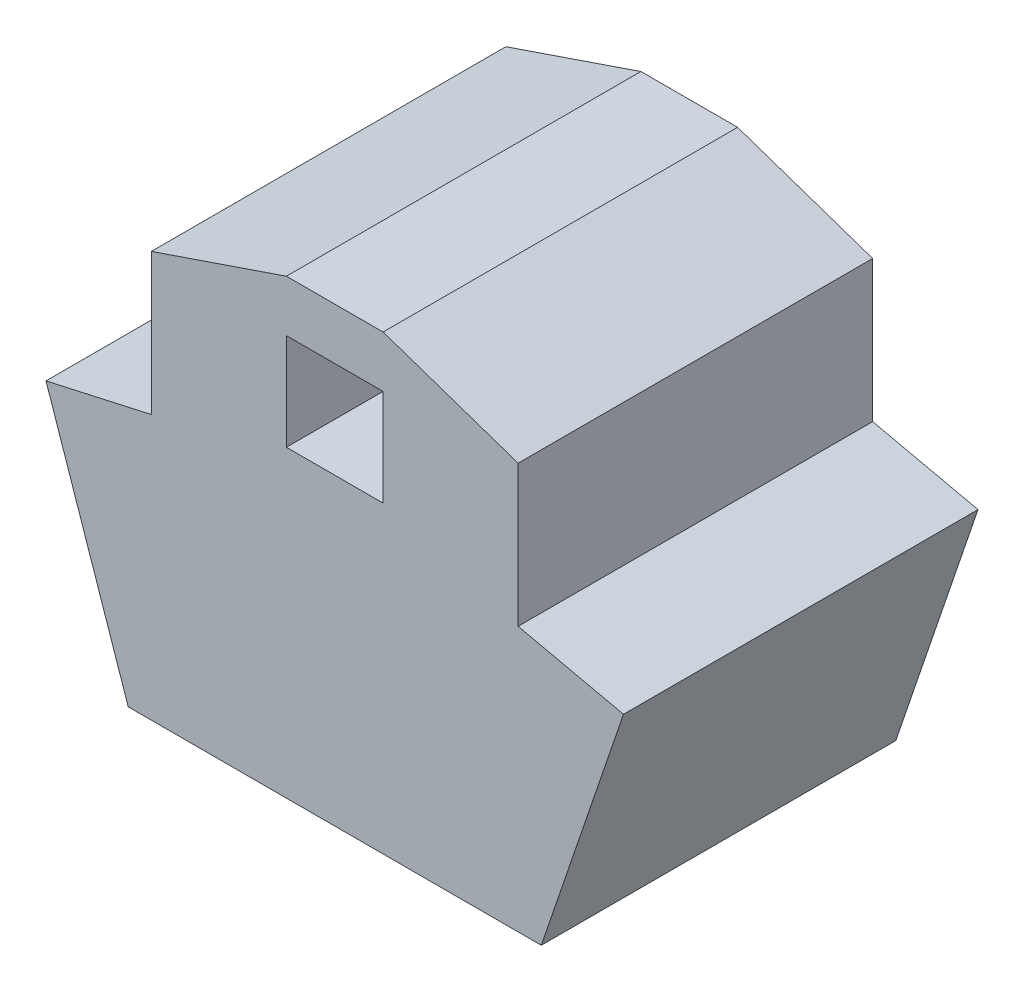
ISO-10303-21;
HEADER;
FILE_DESCRIPTION(('STEP AP214'),'2;1');
FILE_NAME('part.step','',(''),(''),'','','');
FILE_SCHEMA(('AUTOMOTIVE_DESIGN { 1 0 10303 214 1 1 1 1 }'));
ENDSEC;
DATA;
#1=APPLICATION_CONTEXT('core data for automotive mechanical design processes');
#2=APPLICATION_PROTOCOL_DEFINITION('international standard','automotive_design',2000,#1);
#3=PRODUCT_CONTEXT('',#1,'mechanical');
#4=PRODUCT('Part','Part','',(#3));
#5=PRODUCT_RELATED_PRODUCT_CATEGORY('part','',(#4));
#6=PRODUCT_DEFINITION_FORMATION('','',#4);
#7=PRODUCT_DEFINITION_CONTEXT('part definition',#1,'design');
#8=PRODUCT_DEFINITION('design','',#6,#7);
#9=PRODUCT_DEFINITION_SHAPE('','',#8);
#10=(LENGTH_UNIT() NAMED_UNIT(*) SI_UNIT(.MILLI.,.METRE.));
#11=(NAMED_UNIT(*) PLANE_ANGLE_UNIT() SI_UNIT($,.RADIAN.));
#12=(NAMED_UNIT(*) SI_UNIT($,.STERADIAN.) SOLID_ANGLE_UNIT());
#13=UNCERTAINTY_MEASURE_WITH_UNIT(LENGTH_MEASURE(1.E-05),#10,'distance_accuracy_value','');
#14=(GEOMETRIC_REPRESENTATION_CONTEXT(3) GLOBAL_UNCERTAINTY_ASSIGNED_CONTEXT((#13)) GLOBAL_UNIT_ASSIGNED_CONTEXT((#10,
#11,#12)) REPRESENTATION_CONTEXT('',''));
#15=CARTESIAN_POINT('',(0.,0.,0.));
#16=DIRECTION('',(0.,0.,1.));
#17=DIRECTION('',(1.,0.,0.));
#18=AXIS2_PLACEMENT_3D('',#15,#16,#17);
#19=CARTESIAN_POINT('',(-42.816348708637,-73.0225,225.540123598026));
#20=DIRECTION('',(0.,1.,0.));
#21=DIRECTION('',(0.,0.,1.));
#22=AXIS2_PLACEMENT_3D('',#19,#20,#21);
#23=PLANE('',#22);
#24=DIRECTION('',(1.,0.,0.));
#25=VECTOR('',#24,1.);
#26=CARTESIAN_POINT('',(-42.816348708637,-73.0225,73.5));
#27=LINE('',#26,#25);
#28=CARTESIAN_POINT('',(-42.816348708637,-73.0225,73.5000000000001));
#29=VERTEX_POINT('',#28);
#30=CARTESIAN_POINT('',(42.816348708637,-73.0225,73.5000000000001));
#31=VERTEX_POINT('',#30);
#32=EDGE_CURVE('E159',#29,#31,#27,.T.);
#33=ORIENTED_EDGE('',*,*,#32,.F.);
#34=DIRECTION('',(0.,0.,-1.));
#35=VECTOR('',#34,1.);
#36=CARTESIAN_POINT('',(-42.816348708637,-73.0225,225.540123598026));
#37=LINE('',#36,#35);
#38=CARTESIAN_POINT('',(-42.816348708637,-73.0225,0.));
#39=VERTEX_POINT('',#38);
#40=EDGE_CURVE('E144',#29,#39,#37,.T.);
#41=ORIENTED_EDGE('',*,*,#40,.T.);
#42=DIRECTION('',(1.,0.,0.));
#43=VECTOR('',#42,1.);
#44=CARTESIAN_POINT('',(-42.816348708637,-73.0225,0.));
#45=LINE('',#44,#43);
#46=CARTESIAN_POINT('',(42.816348708637,-73.0225,0.));
#47=VERTEX_POINT('',#46);
#48=EDGE_CURVE('E157',#39,#47,#45,.T.);
#49=ORIENTED_EDGE('',*,*,#48,.T.);
#50=DIRECTION('',(0.,0.,-1.));
#51=VECTOR('',#50,1.);
#52=CARTESIAN_POINT('',(42.816348708637,-73.0225,225.540123598026));
#53=LINE('',#52,#51);
#54=EDGE_CURVE('E160',#31,#47,#53,.T.);
#55=ORIENTED_EDGE('',*,*,#54,.F.);
#56=EDGE_LOOP('',(#33,#41,#49,#55));
#57=FACE_BOUND('',#56,.T.);
#58=ADVANCED_FACE('F36',(#57),#23,.F.);
#59=CARTESIAN_POINT('',(0.,0.,73.5));
#60=DIRECTION('',(0.,0.,1.));
#61=DIRECTION('',(1.,0.,0.));
#62=AXIS2_PLACEMENT_3D('',#59,#60,#61);
#63=PLANE('',#62);
#64=DIRECTION('',(-0.975973558178813,0.217888994067592,0.));
#65=VECTOR('',#64,1.);
#66=CARTESIAN_POINT('',(59.8618032540933,-23.0225,73.5));
#67=LINE('',#66,#65);
#68=CARTESIAN_POINT('',(59.8618032540933,-23.0225,73.5));
#69=VERTEX_POINT('',#68);
#70=CARTESIAN_POINT('',(38.0225,-18.1468107179553,73.5));
#71=VERTEX_POINT('',#70);
#72=EDGE_CURVE('E195',#69,#71,#67,.T.);
#73=ORIENTED_EDGE('',*,*,#72,.T.);
#74=DIRECTION('',(0.,1.,0.));
#75=VECTOR('',#74,1.);
#76=CARTESIAN_POINT('',(38.0225,11.1468107179553,73.5));
#77=LINE('',#76,#75);
#78=CARTESIAN_POINT('',(38.0225,11.1468107179553,73.5));
#79=VERTEX_POINT('',#78);
#80=EDGE_CURVE('E198',#71,#79,#77,.T.);
#81=ORIENTED_EDGE('',*,*,#80,.T.);
#82=DIRECTION('',(-0.94651018817854,0.322673927788138,0.));
#83=VECTOR('',#82,1.);
#84=CARTESIAN_POINT('',(10.0225,20.6922652634099,73.5));
#85=LINE('',#84,#83);
#86=CARTESIAN_POINT('',(10.0225,20.6922652634099,73.5));
#87=VERTEX_POINT('',#86);
#88=EDGE_CURVE('E200',#79,#87,#85,.T.);
#89=ORIENTED_EDGE('',*,*,#88,.T.);
#90=DIRECTION('',(-1.,0.,0.));
#91=VECTOR('',#90,1.);
#92=CARTESIAN_POINT('',(10.0225,20.6922652634099,73.5));
#93=LINE('',#92,#91);
#94=CARTESIAN_POINT('',(-10.0225,20.6922652634099,73.5));
#95=VERTEX_POINT('',#94);
#96=EDGE_CURVE('E202',#87,#95,#93,.T.);
#97=ORIENTED_EDGE('',*,*,#96,.T.);
#98=DIRECTION('',(-0.94651018817854,-0.322673927788139,0.));
#99=VECTOR('',#98,1.);
#100=CARTESIAN_POINT('',(-10.0225,20.6922652634099,73.5));
#101=LINE('',#100,#99);
#102=CARTESIAN_POINT('',(-38.0225,11.1468107179553,73.5));
#103=VERTEX_POINT('',#102);
#104=EDGE_CURVE('E204',#95,#103,#101,.T.);
#105=ORIENTED_EDGE('',*,*,#104,.T.);
#106=DIRECTION('',(0.,-1.,0.));
#107=VECTOR('',#106,1.);
#108=CARTESIAN_POINT('',(-38.0225,11.1468107179553,73.5));
#109=LINE('',#108,#107);
#110=CARTESIAN_POINT('',(-38.0225,-18.1468107179553,73.5));
#111=VERTEX_POINT('',#110);
#112=EDGE_CURVE('E206',#103,#111,#109,.T.);
#113=ORIENTED_EDGE('',*,*,#112,.T.);
#114=DIRECTION('',(-0.975973558178813,-0.217888994067592,0.));
#115=VECTOR('',#114,1.);
#116=CARTESIAN_POINT('',(-59.8618032540933,-23.0225,73.5));
#117=LINE('',#116,#115);
#118=CARTESIAN_POINT('',(-59.8618032540933,-23.0225,73.5));
#119=VERTEX_POINT('',#118);
#120=EDGE_CURVE('E208',#111,#119,#117,.T.);
#121=ORIENTED_EDGE('',*,*,#120,.T.);
#122=DIRECTION('',(0.322673927788167,-0.94651018817853,0.));
#123=VECTOR('',#122,1.);
#124=CARTESIAN_POINT('',(-59.8618032540933,-23.0225,73.5));
#125=LINE('',#124,#123);
#126=EDGE_CURVE('E210',#119,#29,#125,.T.);
#127=ORIENTED_EDGE('',*,*,#126,.T.);
#128=ORIENTED_EDGE('',*,*,#32,.T.);
#129=DIRECTION('',(0.322673927788167,0.94651018817853,0.));
#130=VECTOR('',#129,1.);
#131=CARTESIAN_POINT('',(59.8618032540933,-23.0225,73.5));
#132=LINE('',#131,#130);
#133=EDGE_CURVE('E212',#31,#69,#132,.T.);
#134=ORIENTED_EDGE('',*,*,#133,.T.);
#135=EDGE_LOOP('',(#73,#81,#89,#97,#105,#113,#121,#127,#128,#134));
#136=FACE_BOUND('',#135,.T.);
#137=DIRECTION('',(1.,0.,0.));
#138=VECTOR('',#137,1.);
#139=CARTESIAN_POINT('',(10.0225,-10.0225,73.5));
#140=LINE('',#139,#138);
#141=CARTESIAN_POINT('',(-10.0225,-10.0225,73.5));
#142=VERTEX_POINT('',#141);
#143=CARTESIAN_POINT('',(10.0225,-10.0225,73.5));
#144=VERTEX_POINT('',#143);
#145=EDGE_CURVE('E171',#142,#144,#140,.T.);
#146=ORIENTED_EDGE('',*,*,#145,.F.);
#147=DIRECTION('',(0.,-1.,0.));
#148=VECTOR('',#147,1.);
#149=CARTESIAN_POINT('',(-10.0225,-10.0225,73.5));
#150=LINE('',#149,#148);
#151=CARTESIAN_POINT('',(-10.0225,10.0225,73.5));
#152=VERTEX_POINT('',#151);
#153=EDGE_CURVE('E169',#152,#142,#150,.T.);
#154=ORIENTED_EDGE('',*,*,#153,.F.);
#155=DIRECTION('',(-1.,0.,0.));
#156=VECTOR('',#155,1.);
#157=CARTESIAN_POINT('',(10.0225,10.0225,73.5));
#158=LINE('',#157,#156);
#159=CARTESIAN_POINT('',(10.0225,10.0225,73.5));
#160=VERTEX_POINT('',#159);
#161=EDGE_CURVE('E176',#160,#152,#158,.T.);
#162=ORIENTED_EDGE('',*,*,#161,.F.);
#163=DIRECTION('',(0.,1.,0.));
#164=VECTOR('',#163,1.);
#165=CARTESIAN_POINT('',(10.0225,-10.0225,73.5));
#166=LINE('',#165,#164);
#167=EDGE_CURVE('E174',#144,#160,#166,.T.);
#168=ORIENTED_EDGE('',*,*,#167,.F.);
#169=EDGE_LOOP('',(#146,#154,#162,#168));
#170=FACE_BOUND('',#169,.T.);
#171=ADVANCED_FACE('F264',(#136,#170),#63,.T.);
#172=CARTESIAN_POINT('',(0.,0.,0.));
#173=DIRECTION('',(0.,0.,1.));
#174=DIRECTION('',(1.,0.,0.));
#175=AXIS2_PLACEMENT_3D('',#172,#173,#174);
#176=PLANE('',#175);
#177=DIRECTION('',(0.,-1.,0.));
#178=VECTOR('',#177,1.);
#179=CARTESIAN_POINT('',(-10.0225,-10.0225,0.));
#180=LINE('',#179,#178);
#181=CARTESIAN_POINT('',(-10.0225,10.0225,0.));
#182=VERTEX_POINT('',#181);
#183=CARTESIAN_POINT('',(-10.0225,-10.0225,0.));
#184=VERTEX_POINT('',#183);
#185=EDGE_CURVE('E59',#182,#184,#180,.T.);
#186=ORIENTED_EDGE('',*,*,#185,.T.);
#187=DIRECTION('',(1.,0.,0.));
#188=VECTOR('',#187,1.);
#189=CARTESIAN_POINT('',(10.0225,-10.0225,0.));
#190=LINE('',#189,#188);
#191=CARTESIAN_POINT('',(10.0225,-10.0225,0.));
#192=VERTEX_POINT('',#191);
#193=EDGE_CURVE('E180',#184,#192,#190,.T.);
#194=ORIENTED_EDGE('',*,*,#193,.T.);
#195=DIRECTION('',(0.,1.,0.));
#196=VECTOR('',#195,1.);
#197=CARTESIAN_POINT('',(10.0225,-10.0225,0.));
#198=LINE('',#197,#196);
#199=CARTESIAN_POINT('',(10.0225,10.0225,0.));
#200=VERTEX_POINT('',#199);
#201=EDGE_CURVE('E183',#192,#200,#198,.T.);
#202=ORIENTED_EDGE('',*,*,#201,.T.);
#203=DIRECTION('',(-1.,0.,0.));
#204=VECTOR('',#203,1.);
#205=CARTESIAN_POINT('',(10.0225,10.0225,0.));
#206=LINE('',#205,#204);
#207=EDGE_CURVE('E172',#200,#182,#206,.T.);
#208=ORIENTED_EDGE('',*,*,#207,.T.);
#209=EDGE_LOOP('',(#186,#194,#202,#208));
#210=FACE_BOUND('',#209,.T.);
#211=DIRECTION('',(-0.975973558178813,0.217888994067592,0.));
#212=VECTOR('',#211,1.);
#213=CARTESIAN_POINT('',(59.8618032540933,-23.0225,0.));
#214=LINE('',#213,#212);
#215=CARTESIAN_POINT('',(59.8618032540933,-23.0225,0.));
#216=VERTEX_POINT('',#215);
#217=CARTESIAN_POINT('',(38.0225,-18.1468107179553,0.));
#218=VERTEX_POINT('',#217);
#219=EDGE_CURVE('E194',#216,#218,#214,.T.);
#220=ORIENTED_EDGE('',*,*,#219,.F.);
#221=DIRECTION('',(0.322673927788167,0.94651018817853,0.));
#222=VECTOR('',#221,1.);
#223=CARTESIAN_POINT('',(59.8618032540933,-23.0225,0.));
#224=LINE('',#223,#222);
#225=EDGE_CURVE('E150',#47,#216,#224,.T.);
#226=ORIENTED_EDGE('',*,*,#225,.F.);
#227=ORIENTED_EDGE('',*,*,#48,.F.);
#228=DIRECTION('',(0.322673927788167,-0.94651018817853,0.));
#229=VECTOR('',#228,1.);
#230=CARTESIAN_POINT('',(-59.8618032540933,-23.0225,0.));
#231=LINE('',#230,#229);
#232=CARTESIAN_POINT('',(-59.8618032540933,-23.0225,0.));
#233=VERTEX_POINT('',#232);
#234=EDGE_CURVE('E140',#233,#39,#231,.T.);
#235=ORIENTED_EDGE('',*,*,#234,.F.);
#236=DIRECTION('',(-0.975973558178813,-0.217888994067592,0.));
#237=VECTOR('',#236,1.);
#238=CARTESIAN_POINT('',(-59.8618032540933,-23.0225,0.));
#239=LINE('',#238,#237);
#240=CARTESIAN_POINT('',(-38.0225,-18.1468107179553,0.));
#241=VERTEX_POINT('',#240);
#242=EDGE_CURVE('E151',#241,#233,#239,.T.);
#243=ORIENTED_EDGE('',*,*,#242,.F.);
#244=DIRECTION('',(0.,-1.,0.));
#245=VECTOR('',#244,1.);
#246=CARTESIAN_POINT('',(-38.0225,11.1468107179553,0.));
#247=LINE('',#246,#245);
#248=CARTESIAN_POINT('',(-38.0225,11.1468107179553,0.));
#249=VERTEX_POINT('',#248);
#250=EDGE_CURVE('E226',#249,#241,#247,.T.);
#251=ORIENTED_EDGE('',*,*,#250,.F.);
#252=DIRECTION('',(-0.94651018817854,-0.322673927788139,0.));
#253=VECTOR('',#252,1.);
#254=CARTESIAN_POINT('',(-10.0225,20.6922652634099,0.));
#255=LINE('',#254,#253);
#256=CARTESIAN_POINT('',(-10.0225,20.6922652634099,0.));
#257=VERTEX_POINT('',#256);
#258=EDGE_CURVE('E224',#257,#249,#255,.T.);
#259=ORIENTED_EDGE('',*,*,#258,.F.);
#260=DIRECTION('',(-1.,0.,0.));
#261=VECTOR('',#260,1.);
#262=CARTESIAN_POINT('',(-10.0225,20.6922652634099,0.));
#263=LINE('',#262,#261);
#264=CARTESIAN_POINT('',(10.0225,20.6922652634099,0.));
#265=VERTEX_POINT('',#264);
#266=EDGE_CURVE('E222',#265,#257,#263,.T.);
#267=ORIENTED_EDGE('',*,*,#266,.F.);
#268=DIRECTION('',(-0.94651018817854,0.322673927788138,0.));
#269=VECTOR('',#268,1.);
#270=CARTESIAN_POINT('',(10.0225,20.6922652634099,0.));
#271=LINE('',#270,#269);
#272=CARTESIAN_POINT('',(38.0225,11.1468107179553,0.));
#273=VERTEX_POINT('',#272);
#274=EDGE_CURVE('E219',#273,#265,#271,.T.);
#275=ORIENTED_EDGE('',*,*,#274,.F.);
#276=DIRECTION('',(0.,1.,0.));
#277=VECTOR('',#276,1.);
#278=CARTESIAN_POINT('',(38.0225,11.1468107179553,0.));
#279=LINE('',#278,#277);
#280=EDGE_CURVE('E217',#218,#273,#279,.T.);
#281=ORIENTED_EDGE('',*,*,#280,.F.);
#282=EDGE_LOOP('',(#220,#226,#227,#235,#243,#251,#259,#267,#275,#281));
#283=FACE_BOUND('',#282,.T.);
#284=ADVANCED_FACE('F163',(#210,#283),#176,.F.);
#285=CARTESIAN_POINT('',(59.8618032540933,-23.0225,73.5));
#286=DIRECTION('',(-0.217888994067592,-0.975973558178813,0.));
#287=DIRECTION('',(0.975973558178813,-0.217888994067592,0.));
#288=AXIS2_PLACEMENT_3D('',#285,#286,#287);
#289=PLANE('',#288);
#290=ORIENTED_EDGE('',*,*,#219,.T.);
#291=DIRECTION('',(0.,0.,-1.));
#292=VECTOR('',#291,1.);
#293=CARTESIAN_POINT('',(38.0225,-18.1468107179553,73.5));
#294=LINE('',#293,#292);
#295=EDGE_CURVE('E11',#71,#218,#294,.T.);
#296=ORIENTED_EDGE('',*,*,#295,.F.);
#297=ORIENTED_EDGE('',*,*,#72,.F.);
#298=DIRECTION('',(0.,0.,-1.));
#299=VECTOR('',#298,1.);
#300=CARTESIAN_POINT('',(59.8618032540933,-23.0225,73.5));
#301=LINE('',#300,#299);
#302=EDGE_CURVE('E214',#69,#216,#301,.T.);
#303=ORIENTED_EDGE('',*,*,#302,.T.);
#304=EDGE_LOOP('',(#290,#296,#297,#303));
#305=FACE_BOUND('',#304,.T.);
#306=ADVANCED_FACE('F38',(#305),#289,.F.);
#307=CARTESIAN_POINT('',(38.0225,11.1468107179553,73.5));
#308=DIRECTION('',(-1.,0.,0.));
#309=DIRECTION('',(0.,-1.,0.));
#310=AXIS2_PLACEMENT_3D('',#307,#308,#309);
#311=PLANE('',#310);
#312=ORIENTED_EDGE('',*,*,#280,.T.);
#313=DIRECTION('',(0.,0.,-1.));
#314=VECTOR('',#313,1.);
#315=CARTESIAN_POINT('',(38.0225,11.1468107179553,73.5));
#316=LINE('',#315,#314);
#317=EDGE_CURVE('E44',#79,#273,#316,.T.);
#318=ORIENTED_EDGE('',*,*,#317,.F.);
#319=ORIENTED_EDGE('',*,*,#80,.F.);
#320=ORIENTED_EDGE('',*,*,#295,.T.);
#321=EDGE_LOOP('',(#312,#318,#319,#320));
#322=FACE_BOUND('',#321,.T.);
#323=ADVANCED_FACE('F269',(#322),#311,.F.);
#324=CARTESIAN_POINT('',(10.0225,20.6922652634099,73.5));
#325=DIRECTION('',(-0.322673927788138,-0.94651018817854,0.));
#326=DIRECTION('',(0.94651018817854,-0.322673927788138,0.));
#327=AXIS2_PLACEMENT_3D('',#324,#325,#326);
#328=PLANE('',#327);
#329=ORIENTED_EDGE('',*,*,#274,.T.);
#330=DIRECTION('',(0.,0.,-1.));
#331=VECTOR('',#330,1.);
#332=CARTESIAN_POINT('',(10.0225,20.6922652634099,73.5));
#333=LINE('',#332,#331);
#334=EDGE_CURVE('E242',#87,#265,#333,.T.);
#335=ORIENTED_EDGE('',*,*,#334,.F.);
#336=ORIENTED_EDGE('',*,*,#88,.F.);
#337=ORIENTED_EDGE('',*,*,#317,.T.);
#338=EDGE_LOOP('',(#329,#335,#336,#337));
#339=FACE_BOUND('',#338,.T.);
#340=ADVANCED_FACE('F249',(#339),#328,.F.);
#341=CARTESIAN_POINT('',(-10.0225,20.6922652634099,73.5));
#342=DIRECTION('',(0.,-1.,0.));
#343=DIRECTION('',(0.,0.,-1.));
#344=AXIS2_PLACEMENT_3D('',#341,#342,#343);
#345=PLANE('',#344);
#346=ORIENTED_EDGE('',*,*,#266,.T.);
#347=DIRECTION('',(0.,0.,-1.));
#348=VECTOR('',#347,1.);
#349=CARTESIAN_POINT('',(-10.0225,20.6922652634099,73.5));
#350=LINE('',#349,#348);
#351=EDGE_CURVE('E239',#95,#257,#350,.T.);
#352=ORIENTED_EDGE('',*,*,#351,.F.);
#353=ORIENTED_EDGE('',*,*,#96,.F.);
#354=ORIENTED_EDGE('',*,*,#334,.T.);
#355=EDGE_LOOP('',(#346,#352,#353,#354));
#356=FACE_BOUND('',#355,.T.);
#357=ADVANCED_FACE('F256',(#356),#345,.F.);
#358=CARTESIAN_POINT('',(-10.0225,20.6922652634099,73.5));
#359=DIRECTION('',(0.322673927788139,-0.94651018817854,0.));
#360=DIRECTION('',(0.94651018817854,0.322673927788139,0.));
#361=AXIS2_PLACEMENT_3D('',#358,#359,#360);
#362=PLANE('',#361);
#363=ORIENTED_EDGE('',*,*,#258,.T.);
#364=DIRECTION('',(0.,0.,-1.));
#365=VECTOR('',#364,1.);
#366=CARTESIAN_POINT('',(-38.0225,11.1468107179553,73.5));
#367=LINE('',#366,#365);
#368=EDGE_CURVE('E236',#103,#249,#367,.T.);
#369=ORIENTED_EDGE('',*,*,#368,.F.);
#370=ORIENTED_EDGE('',*,*,#104,.F.);
#371=ORIENTED_EDGE('',*,*,#351,.T.);
#372=EDGE_LOOP('',(#363,#369,#370,#371));
#373=FACE_BOUND('',#372,.T.);
#374=ADVANCED_FACE('F260',(#373),#362,.F.);
#375=CARTESIAN_POINT('',(-38.0225,11.1468107179553,73.5));
#376=DIRECTION('',(1.,0.,0.));
#377=DIRECTION('',(0.,1.,0.));
#378=AXIS2_PLACEMENT_3D('',#375,#376,#377);
#379=PLANE('',#378);
#380=ORIENTED_EDGE('',*,*,#250,.T.);
#381=DIRECTION('',(0.,0.,-1.));
#382=VECTOR('',#381,1.);
#383=CARTESIAN_POINT('',(-38.0225,-18.1468107179553,73.5));
#384=LINE('',#383,#382);
#385=EDGE_CURVE('E233',#111,#241,#384,.T.);
#386=ORIENTED_EDGE('',*,*,#385,.F.);
#387=ORIENTED_EDGE('',*,*,#112,.F.);
#388=ORIENTED_EDGE('',*,*,#368,.T.);
#389=EDGE_LOOP('',(#380,#386,#387,#388));
#390=FACE_BOUND('',#389,.T.);
#391=ADVANCED_FACE('F278',(#390),#379,.F.);
#392=CARTESIAN_POINT('',(-59.8618032540933,-23.0225,73.5));
#393=DIRECTION('',(0.217888994067592,-0.975973558178813,0.));
#394=DIRECTION('',(0.975973558178813,0.217888994067592,0.));
#395=AXIS2_PLACEMENT_3D('',#392,#393,#394);
#396=PLANE('',#395);
#397=ORIENTED_EDGE('',*,*,#242,.T.);
#398=DIRECTION('',(0.,0.,-1.));
#399=VECTOR('',#398,1.);
#400=CARTESIAN_POINT('',(-59.8618032540933,-23.0225,73.5));
#401=LINE('',#400,#399);
#402=EDGE_CURVE('E146',#119,#233,#401,.T.);
#403=ORIENTED_EDGE('',*,*,#402,.F.);
#404=ORIENTED_EDGE('',*,*,#120,.F.);
#405=ORIENTED_EDGE('',*,*,#385,.T.);
#406=EDGE_LOOP('',(#397,#403,#404,#405));
#407=FACE_BOUND('',#406,.T.);
#408=ADVANCED_FACE('F276',(#407),#396,.F.);
#409=CARTESIAN_POINT('',(-59.8618032540933,-23.0225,73.5));
#410=DIRECTION('',(0.94651018817853,0.322673927788167,0.));
#411=DIRECTION('',(-0.322673927788167,0.94651018817853,0.));
#412=AXIS2_PLACEMENT_3D('',#409,#410,#411);
#413=PLANE('',#412);
#414=ORIENTED_EDGE('',*,*,#234,.T.);
#415=ORIENTED_EDGE('',*,*,#40,.F.);
#416=ORIENTED_EDGE('',*,*,#126,.F.);
#417=ORIENTED_EDGE('',*,*,#402,.T.);
#418=EDGE_LOOP('',(#414,#415,#416,#417));
#419=FACE_BOUND('',#418,.T.);
#420=ADVANCED_FACE('F142',(#419),#413,.F.);
#421=CARTESIAN_POINT('',(59.8618032540933,-23.0225,73.5));
#422=DIRECTION('',(-0.94651018817853,0.322673927788167,0.));
#423=DIRECTION('',(-0.322673927788167,-0.94651018817853,0.));
#424=AXIS2_PLACEMENT_3D('',#421,#422,#423);
#425=PLANE('',#424);
#426=ORIENTED_EDGE('',*,*,#225,.T.);
#427=ORIENTED_EDGE('',*,*,#302,.F.);
#428=ORIENTED_EDGE('',*,*,#133,.F.);
#429=ORIENTED_EDGE('',*,*,#54,.T.);
#430=EDGE_LOOP('',(#426,#427,#428,#429));
#431=FACE_BOUND('',#430,.T.);
#432=ADVANCED_FACE('F273',(#431),#425,.F.);
#433=CARTESIAN_POINT('',(-10.0225,-10.0225,73.5));
#434=DIRECTION('',(1.,0.,0.));
#435=DIRECTION('',(0.,0.,-1.));
#436=AXIS2_PLACEMENT_3D('',#433,#434,#435);
#437=PLANE('',#436);
#438=ORIENTED_EDGE('',*,*,#185,.F.);
#439=DIRECTION('',(0.,0.,-1.));
#440=VECTOR('',#439,1.);
#441=CARTESIAN_POINT('',(-10.0225,10.0225,73.5));
#442=LINE('',#441,#440);
#443=EDGE_CURVE('E178',#152,#182,#442,.T.);
#444=ORIENTED_EDGE('',*,*,#443,.F.);
#445=ORIENTED_EDGE('',*,*,#153,.T.);
#446=DIRECTION('',(0.,0.,-1.));
#447=VECTOR('',#446,1.);
#448=CARTESIAN_POINT('',(-10.0225,-10.0225,73.5));
#449=LINE('',#448,#447);
#450=EDGE_CURVE('E192',#142,#184,#449,.T.);
#451=ORIENTED_EDGE('',*,*,#450,.T.);
#452=EDGE_LOOP('',(#438,#444,#445,#451));
#453=FACE_BOUND('',#452,.T.);
#454=ADVANCED_FACE('F304',(#453),#437,.T.);
#455=CARTESIAN_POINT('',(10.0225,-10.0225,73.5));
#456=DIRECTION('',(0.,1.,0.));
#457=DIRECTION('',(-1.,0.,0.));
#458=AXIS2_PLACEMENT_3D('',#455,#456,#457);
#459=PLANE('',#458);
#460=ORIENTED_EDGE('',*,*,#193,.F.);
#461=ORIENTED_EDGE('',*,*,#450,.F.);
#462=ORIENTED_EDGE('',*,*,#145,.T.);
#463=DIRECTION('',(0.,0.,-1.));
#464=VECTOR('',#463,1.);
#465=CARTESIAN_POINT('',(10.0225,-10.0225,73.5));
#466=LINE('',#465,#464);
#467=EDGE_CURVE('E190',#144,#192,#466,.T.);
#468=ORIENTED_EDGE('',*,*,#467,.T.);
#469=EDGE_LOOP('',(#460,#461,#462,#468));
#470=FACE_BOUND('',#469,.T.);
#471=ADVANCED_FACE('F300',(#470),#459,.T.);
#472=CARTESIAN_POINT('',(10.0225,-10.0225,73.5));
#473=DIRECTION('',(-1.,0.,0.));
#474=DIRECTION('',(0.,0.,1.));
#475=AXIS2_PLACEMENT_3D('',#472,#473,#474);
#476=PLANE('',#475);
#477=ORIENTED_EDGE('',*,*,#201,.F.);
#478=ORIENTED_EDGE('',*,*,#467,.F.);
#479=ORIENTED_EDGE('',*,*,#167,.T.);
#480=DIRECTION('',(0.,0.,-1.));
#481=VECTOR('',#480,1.);
#482=CARTESIAN_POINT('',(10.0225,10.0225,73.5));
#483=LINE('',#482,#481);
#484=EDGE_CURVE('E51',#160,#200,#483,.T.);
#485=ORIENTED_EDGE('',*,*,#484,.T.);
#486=EDGE_LOOP('',(#477,#478,#479,#485));
#487=FACE_BOUND('',#486,.T.);
#488=ADVANCED_FACE('F297',(#487),#476,.T.);
#489=CARTESIAN_POINT('',(10.0225,10.0225,73.5));
#490=DIRECTION('',(0.,-1.,0.));
#491=DIRECTION('',(1.,0.,0.));
#492=AXIS2_PLACEMENT_3D('',#489,#490,#491);
#493=PLANE('',#492);
#494=ORIENTED_EDGE('',*,*,#207,.F.);
#495=ORIENTED_EDGE('',*,*,#484,.F.);
#496=ORIENTED_EDGE('',*,*,#161,.T.);
#497=ORIENTED_EDGE('',*,*,#443,.T.);
#498=EDGE_LOOP('',(#494,#495,#496,#497));
#499=FACE_BOUND('',#498,.T.);
#500=ADVANCED_FACE('F294',(#499),#493,.T.);
#501=CLOSED_SHELL('',(#58,#171,#284,#306,#323,#340,#357,#374,#391,#408,#420,#432,#454,#471,#488,#500));
#502=MANIFOLD_SOLID_BREP('B2',#501);
#503=ADVANCED_BREP_SHAPE_REPRESENTATION('',(#18,#502),#14);
#504=SHAPE_DEFINITION_REPRESENTATION(#9,#503);
ENDSEC;
END-ISO-10303-21;
